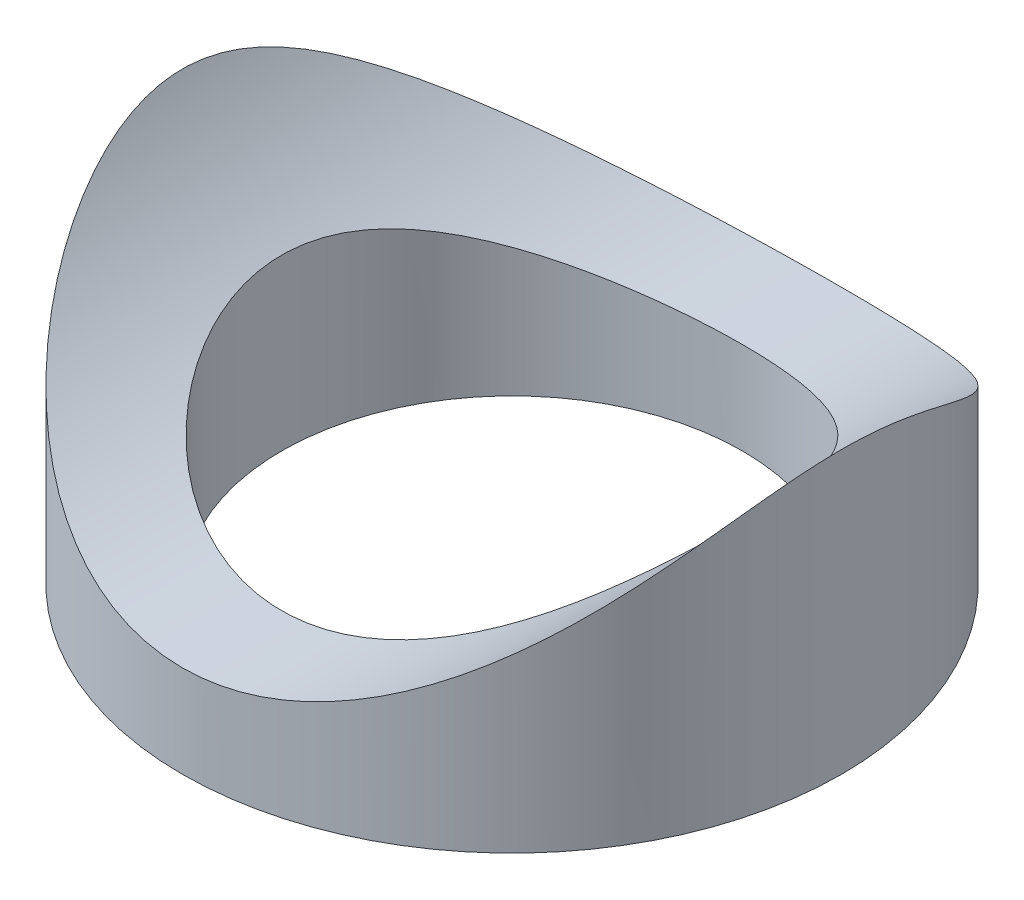
ISO-10303-21;
HEADER;
FILE_DESCRIPTION(('STEP AP214'),'2;1');
FILE_NAME('part.step','',(''),(''),'','','');
FILE_SCHEMA(('AUTOMOTIVE_DESIGN { 1 0 10303 214 1 1 1 1 }'));
ENDSEC;
DATA;
#1=APPLICATION_CONTEXT('core data for automotive mechanical design processes');
#2=APPLICATION_PROTOCOL_DEFINITION('international standard','automotive_design',2000,#1);
#3=PRODUCT_CONTEXT('',#1,'mechanical');
#4=PRODUCT('Part','Part','',(#3));
#5=PRODUCT_RELATED_PRODUCT_CATEGORY('part','',(#4));
#6=PRODUCT_DEFINITION_FORMATION('','',#4);
#7=PRODUCT_DEFINITION_CONTEXT('part definition',#1,'design');
#8=PRODUCT_DEFINITION('design','',#6,#7);
#9=PRODUCT_DEFINITION_SHAPE('','',#8);
#10=(LENGTH_UNIT() NAMED_UNIT(*) SI_UNIT(.MILLI.,.METRE.));
#11=(NAMED_UNIT(*) PLANE_ANGLE_UNIT() SI_UNIT($,.RADIAN.));
#12=(NAMED_UNIT(*) SI_UNIT($,.STERADIAN.) SOLID_ANGLE_UNIT());
#13=UNCERTAINTY_MEASURE_WITH_UNIT(LENGTH_MEASURE(1.E-05),#10,'distance_accuracy_value','');
#14=(GEOMETRIC_REPRESENTATION_CONTEXT(3) GLOBAL_UNCERTAINTY_ASSIGNED_CONTEXT((#13)) GLOBAL_UNIT_ASSIGNED_CONTEXT((#10,
#11,#12)) REPRESENTATION_CONTEXT('',''));
#15=CARTESIAN_POINT('',(0.,0.,0.));
#16=DIRECTION('',(0.,0.,1.));
#17=DIRECTION('',(1.,0.,0.));
#18=AXIS2_PLACEMENT_3D('',#15,#16,#17);
#19=CARTESIAN_POINT('',(0.,10.,0.));
#20=DIRECTION('',(0.,-1.,0.));
#21=DIRECTION('',(0.,0.,-1.));
#22=AXIS2_PLACEMENT_3D('',#19,#20,#21);
#23=CYLINDRICAL_SURFACE('',#22,7.15);
#24=CARTESIAN_POINT('',(0.,1.,-7.15));
#25=CARTESIAN_POINT('',(0.167988015463853,1.00000108155753,-7.1499988949458));
#26=CARTESIAN_POINT('',(0.335992879920423,1.00512334234921,-7.14406886888693));
#27=CARTESIAN_POINT('',(0.670564789268215,1.02549549374263,-7.12046202636341));
#28=CARTESIAN_POINT('',(0.837131635858191,1.0407467592207,-7.1027836152131));
#29=CARTESIAN_POINT('',(1.16751808806879,1.08103619824084,-7.05600798302752));
#30=CARTESIAN_POINT('',(1.33133651401525,1.10607846757693,-7.02690598323148));
#31=CARTESIAN_POINT('',(1.65500657556457,1.16541776550851,-6.95779118775306));
#32=CARTESIAN_POINT('',(1.8148563966595,1.19971894532454,-6.91777349795022));
#33=CARTESIAN_POINT('',(2.12844798142176,1.27662625088511,-6.8277840336711));
#34=CARTESIAN_POINT('',(2.28222349911335,1.3191751811193,-6.77788076302837));
#35=CARTESIAN_POINT('',(2.58403196601238,1.41195379830891,-6.66866369198493));
#36=CARTESIAN_POINT('',(2.73206236382393,1.46218684992114,-6.60934576874789));
#37=CARTESIAN_POINT('',(3.16653963685483,1.62319763657309,-6.41836865351799));
#38=CARTESIAN_POINT('',(3.44358547665019,1.74434089053991,-6.27362362816584));
#39=CARTESIAN_POINT('',(3.88798372671323,1.96676225015789,-6.00428027551445));
#40=CARTESIAN_POINT('',(4.06282629916805,2.06265435552958,-5.88722340007016));
#41=CARTESIAN_POINT('',(4.39872470770204,2.26232704395195,-5.64066255347244));
#42=CARTESIAN_POINT('',(4.55978041791764,2.36610769900277,-5.51115846870836));
#43=CARTESIAN_POINT('',(4.86834543372062,2.57978038457326,-5.24060619362974));
#44=CARTESIAN_POINT('',(5.01581907702101,2.6896873521153,-5.09952935364694));
#45=CARTESIAN_POINT('',(5.29682452603425,2.91334610774556,-4.80700293155699));
#46=CARTESIAN_POINT('',(5.43035817995873,3.02709738348822,-4.65555472894112));
#47=CARTESIAN_POINT('',(5.6862322030435,3.25874152385548,-4.33952371465198));
#48=CARTESIAN_POINT('',(5.80828255342061,3.37667134026922,-4.17473345994307));
#49=CARTESIAN_POINT('',(6.03805000854108,3.61189811570583,-3.83491102925146));
#50=CARTESIAN_POINT('',(6.14576242641082,3.7291948558218,-3.65987553102653));
#51=CARTESIAN_POINT('',(6.34643899979447,3.95981145840405,-3.29964339312331));
#52=CARTESIAN_POINT('',(6.43943334934589,4.07313908131621,-3.11446863344969));
#53=CARTESIAN_POINT('',(6.61035969587434,4.29193563628963,-2.73300103319816));
#54=CARTESIAN_POINT('',(6.68830375087305,4.39741081760123,-2.53671725738382));
#55=CARTESIAN_POINT('',(6.8313998298101,4.59957483736965,-2.12243682703469));
#56=CARTESIAN_POINT('',(6.8957879240776,4.69562652224929,-1.90385484077781));
#57=CARTESIAN_POINT('',(7.00462502082316,4.86370018738762,-1.45300692660444));
#58=CARTESIAN_POINT('',(7.04911793859631,4.93577500158758,-1.22077243031966));
#59=CARTESIAN_POINT('',(7.11041398476884,5.03694900557948,-0.778947331121638));
#60=CARTESIAN_POINT('',(7.1302784102896,5.07073702257414,-0.570901448546908));
#61=CARTESIAN_POINT('',(7.15147715938702,5.10683745240552,-0.151219134828342));
#62=CARTESIAN_POINT('',(7.15283235292934,5.10918531532765,0.0604129829370483));
#63=CARTESIAN_POINT('',(7.13693616632781,5.08205636244413,0.48043406204001));
#64=CARTESIAN_POINT('',(7.11971500162396,5.05263122704015,0.688827732376483));
#65=CARTESIAN_POINT('',(7.06821090019616,4.96709019200255,1.09800163164706));
#66=CARTESIAN_POINT('',(7.0338964139448,4.91092494605964,1.29876704068919));
#67=CARTESIAN_POINT('',(6.95732333022975,4.79020656603394,1.65705744356144));
#68=CARTESIAN_POINT('',(6.91739175514392,4.72868129999898,1.8161504413116));
#69=CARTESIAN_POINT('',(6.82807299898693,4.59574623759871,2.12747716583832));
#70=CARTESIAN_POINT('',(6.77867925538352,4.5243295905973,2.27970604091207));
#71=CARTESIAN_POINT('',(6.67095618638032,4.37436063323471,2.57799988185181));
#72=CARTESIAN_POINT('',(6.6125965923445,4.29578453262183,2.72404174616067));
#73=CARTESIAN_POINT('',(6.48752134117419,4.13403727885885,3.00979729342209));
#74=CARTESIAN_POINT('',(6.42080665335767,4.0508666593674,3.149511707899));
#75=CARTESIAN_POINT('',(6.24388884130149,3.83945229298177,3.49137985002487));
#76=CARTESIAN_POINT('',(6.12861468069926,3.70945563049525,3.68984290114431));
#77=CARTESIAN_POINT('',(5.88015129809202,3.44777541953551,4.07414703007747));
#78=CARTESIAN_POINT('',(5.74695352082575,3.31609109283576,4.25998201614584));
#79=CARTESIAN_POINT('',(5.46284992034077,3.05481924263079,4.61866128850005));
#80=CARTESIAN_POINT('',(5.31196808561842,2.92522914387858,4.7915226628455));
#81=CARTESIAN_POINT('',(4.99225997224588,2.67111071927793,5.12376271688419));
#82=CARTESIAN_POINT('',(4.82344170126334,2.54658016865151,5.28314735662477));
#83=CARTESIAN_POINT('',(4.51104698292928,2.3348364498549,5.55016076915499));
#84=CARTESIAN_POINT('',(4.37131873369326,2.24591404381094,5.66094864053327));
#85=CARTESIAN_POINT('',(4.08160686998257,2.07394379591184,5.87326345844128));
#86=CARTESIAN_POINT('',(3.93162579524515,1.99089450951634,5.97479268399948));
#87=CARTESIAN_POINT('',(3.62177820765863,1.83208788151978,6.16753361773404));
#88=CARTESIAN_POINT('',(3.4619234701632,1.75632211919919,6.25875726244194));
#89=CARTESIAN_POINT('',(3.13260850366837,1.61336030502639,6.4299049228716));
#90=CARTESIAN_POINT('',(2.9631500131638,1.54616270925587,6.50983097461611));
#91=CARTESIAN_POINT('',(2.64562613615451,1.43255817653914,6.64435873894966));
#92=CARTESIAN_POINT('',(2.49896678692552,1.38456799540807,6.70094718353915));
#93=CARTESIAN_POINT('',(2.20020813902601,1.2961576187741,6.80489433114436));
#94=CARTESIAN_POINT('',(2.04810996571397,1.25573586794246,6.85225493058359));
#95=CARTESIAN_POINT('',(1.73929111439598,1.18318497868222,6.93707402614606));
#96=CARTESIAN_POINT('',(1.58257205316605,1.15105297728088,6.97453594101717));
#97=CARTESIAN_POINT('',(1.26543611614853,1.09568709505576,7.03898786520295));
#98=CARTESIAN_POINT('',(1.10501920002368,1.07245331134502,7.06597776022852));
#99=CARTESIAN_POINT('',(0.780911033886621,1.03528642854994,7.109115455377));
#100=CARTESIAN_POINT('',(0.617208254989675,1.02139587597408,7.12521365965528));
#101=CARTESIAN_POINT('',(0.288541997236335,1.00339271078426,7.14607277432099));
#102=CARTESIAN_POINT('',(0.123578515548014,0.999280120141093,7.1508336592338));
#103=CARTESIAN_POINT('',(-0.206224102867415,1.00092610979816,7.14892751733558));
#104=CARTESIAN_POINT('',(-0.371063245067565,1.00668422677614,7.14226102691541));
#105=CARTESIAN_POINT('',(-0.699253304137799,1.02794066448245,7.11762755906592));
#106=CARTESIAN_POINT('',(-0.862604277966941,1.04343861082023,7.09966101600078));
#107=CARTESIAN_POINT('',(-1.17482795891815,1.08237119080872,7.0544552885008));
#108=CARTESIAN_POINT('',(-1.32389436170144,1.10515188146585,7.02797939227665));
#109=CARTESIAN_POINT('',(-1.61877929048442,1.15839845055141,6.96597186463892));
#110=CARTESIAN_POINT('',(-1.76459671126293,1.18886690200013,6.93043720130105));
#111=CARTESIAN_POINT('',(-2.05210891176568,1.2569667158089,6.85080941119685));
#112=CARTESIAN_POINT('',(-2.19380491948299,1.29459591885733,6.80671886436274));
#113=CARTESIAN_POINT('',(-2.47251238681481,1.37644304459676,6.71051024584004));
#114=CARTESIAN_POINT('',(-2.60952208051581,1.42066341808769,6.6583891879165));
#115=CARTESIAN_POINT('',(-3.03487594789062,1.57008138914362,6.48160147655288));
#116=CARTESIAN_POINT('',(-3.3137579350889,1.68634706621757,6.3431050173282));
#117=CARTESIAN_POINT('',(-3.84396499752116,1.94044822780328,6.03659622363694));
#118=CARTESIAN_POINT('',(-4.09526880017902,2.07830016683235,5.86856136091136));
#119=CARTESIAN_POINT('',(-4.51141950177076,2.33379865819459,5.55160491803334));
#120=CARTESIAN_POINT('',(-4.68240944756601,2.44818013371203,5.40800783661563));
#121=CARTESIAN_POINT('',(-5.00803870590189,2.68316339638607,5.10794264770781));
#122=CARTESIAN_POINT('',(-5.16267708735716,2.8037655371766,4.95147380817931));
#123=CARTESIAN_POINT('',(-5.45601794800868,3.04887769824047,4.62627728784498));
#124=CARTESIAN_POINT('',(-5.59468305018599,3.17339604979481,4.45752230430718));
#125=CARTESIAN_POINT('',(-5.85574839138565,3.42327582413514,4.10855146410628));
#126=CARTESIAN_POINT('',(-5.97815391451751,3.54863695904654,3.92833935911923));
#127=CARTESIAN_POINT('',(-6.18049493983635,3.76848338824628,3.59892892236717));
#128=CARTESIAN_POINT('',(-6.26373632191999,3.86346384586665,3.45208154255715));
#129=CARTESIAN_POINT('',(-6.42040000208977,4.05011489074376,3.15115143227213));
#130=CARTESIAN_POINT('',(-6.49382081625872,4.1417849762691,2.99706761309139));
#131=CARTESIAN_POINT('',(-6.63031147930326,4.31916795959385,2.68158995039722));
#132=CARTESIAN_POINT('',(-6.69340632576192,4.40489494548576,2.52021500465166));
#133=CARTESIAN_POINT('',(-6.80879322112156,4.56739378140382,2.18941421426926));
#134=CARTESIAN_POINT('',(-6.86109225300552,4.64417140600294,2.01999366151449));
#135=CARTESIAN_POINT('',(-6.9632693630215,4.7987616254053,1.63763957957528));
#136=CARTESIAN_POINT('',(-7.01057223224903,4.87371130836867,1.42277929732242));
#137=CARTESIAN_POINT('',(-7.06693079745445,4.96512090959931,1.09245472513542));
#138=CARTESIAN_POINT('',(-7.08327779116018,4.99207635050935,0.981091097465617));
#139=CARTESIAN_POINT('',(-7.11081074339003,5.037891369955,0.75610511807645));
#140=CARTESIAN_POINT('',(-7.12199940886123,5.05675519438321,0.642483983763595));
#141=CARTESIAN_POINT('',(-7.13903888291915,5.08562120990808,0.41240389680462));
#142=CARTESIAN_POINT('',(-7.14482830431162,5.09552145268512,0.295927402914954));
#143=CARTESIAN_POINT('',(-7.15068127199945,5.10553088668519,0.0624103624036391));
#144=CARTESIAN_POINT('',(-7.15074519020698,5.1056407138654,-0.0546301470872776));
#145=CARTESIAN_POINT('',(-7.14514412342531,5.09606109027383,-0.28822366587059));
#146=CARTESIAN_POINT('',(-7.13947627584936,5.08636674305278,-0.404776402351219));
#147=CARTESIAN_POINT('',(-7.12257157969353,5.05772029366061,-0.636372472592581));
#148=CARTESIAN_POINT('',(-7.11133155826686,5.03876291712425,-0.751414908020172));
#149=CARTESIAN_POINT('',(-7.08108688206013,4.98842504328915,-0.999492843429912));
#150=CARTESIAN_POINT('',(-7.06105419397326,4.95543077436513,-1.13207349550507));
#151=CARTESIAN_POINT('',(-7.01419148114041,4.87983088069488,-1.39328969128514));
#152=CARTESIAN_POINT('',(-6.98735584579102,4.83721732581607,-1.52192187991998));
#153=CARTESIAN_POINT('',(-6.92734100577797,4.74420753537128,-1.77523017891099));
#154=CARTESIAN_POINT('',(-6.89414336189662,4.69378876139017,-1.89989353049067));
#155=CARTESIAN_POINT('',(-6.82191239891069,4.58701868881174,-2.14483320566658));
#156=CARTESIAN_POINT('',(-6.78288043929166,4.53066877316444,-2.2651105431713));
#157=CARTESIAN_POINT('',(-6.67004251968181,4.37247079533324,-2.58428176074328));
#158=CARTESIAN_POINT('',(-6.59102539479713,4.26639384914443,-2.77924885206972));
#159=CARTESIAN_POINT('',(-6.4181039530466,4.04684306744754,-3.15813724154256));
#160=CARTESIAN_POINT('',(-6.32418972283959,3.93336433620964,-3.34205107107401));
#161=CARTESIAN_POINT('',(-6.12182447860496,3.70279336525416,-3.69973354155075));
#162=CARTESIAN_POINT('',(-6.01335361568659,3.58569636263708,-3.87348785652631));
#163=CARTESIAN_POINT('',(-5.78215001551493,3.35106424007238,-4.21082374641993));
#164=CARTESIAN_POINT('',(-5.65942070470901,3.23352923192617,-4.37440775091919));
#165=CARTESIAN_POINT('',(-5.39243893807011,2.9939895823176,-4.70009094336836));
#166=CARTESIAN_POINT('',(-5.24737118920316,2.87209761150567,-4.86160682847071));
#167=CARTESIAN_POINT('',(-4.94112026506712,2.63308558030784,-5.17256687360979));
#168=CARTESIAN_POINT('',(-4.77993389752316,2.51596647167244,-5.32200863174126));
#169=CARTESIAN_POINT('',(-4.44180403358384,2.2892834500057,-5.60728914070063));
#170=CARTESIAN_POINT('',(-4.26489769767133,2.17970275134474,-5.7431584398821));
#171=CARTESIAN_POINT('',(-3.89522166953088,1.9703683121707,-6.00002903035306));
#172=CARTESIAN_POINT('',(-3.70245987284699,1.8706097342626,-6.12103764786461));
#173=CARTESIAN_POINT('',(-3.362175705186,1.71177490243496,-6.31221321908655));
#174=CARTESIAN_POINT('',(-3.21855377001971,1.64950604849301,-6.38670347689973));
#175=CARTESIAN_POINT('',(-2.9242567391363,1.53195438960882,-6.52669572919649));
#176=CARTESIAN_POINT('',(-2.77358344089789,1.47666981743821,-6.59219999776087));
#177=CARTESIAN_POINT('',(-2.4658957195681,1.37405081624421,-6.71335742059365));
#178=CARTESIAN_POINT('',(-2.30888815986686,1.32670805452982,-6.76902090333983));
#179=CARTESIAN_POINT('',(-1.9891775608386,1.24078647992695,-6.86977050444797));
#180=CARTESIAN_POINT('',(-1.82647536128804,1.20220638105917,-6.91485817491285));
#181=CARTESIAN_POINT('',(-1.52726661876535,1.14091967067453,-6.98634377869699));
#182=CARTESIAN_POINT('',(-1.39154606408949,1.11659403205927,-7.01465975968285));
#183=CARTESIAN_POINT('',(-1.11769302091288,1.0746149552832,-7.06346934953866));
#184=CARTESIAN_POINT('',(-0.979560828028381,1.05696070527478,-7.08396391020769));
#185=CARTESIAN_POINT('',(-0.701596962410924,1.02859519228974,-7.11687087103667));
#186=CARTESIAN_POINT('',(-0.561764947305554,1.0178853524538,-7.12928161455591));
#187=CARTESIAN_POINT('',(-0.281292403272919,1.00358828324475,-7.14584550582072));
#188=CARTESIAN_POINT('',(-0.140652107451416,0.999999094439292,-7.15000092523387));
#189=CARTESIAN_POINT('',(0.,1.,-7.15));
#190=B_SPLINE_CURVE_WITH_KNOTS('',3,(#24,#25,#26,#27,#28,#29,#30,#31,#32,#33,#34,#35,#36,#37,
#38,#39,#40,#41,#42,#43,#44,#45,#46,#47,#48,#49,#50,#51,#52,#53,#54,#55,#56,#57,#58,#59,#60,#61,
#62,#63,#64,#65,#66,#67,#68,#69,#70,#71,#72,#73,#74,#75,#76,#77,#78,#79,#80,#81,#82,#83,#84,#85,
#86,#87,#88,#89,#90,#91,#92,#93,#94,#95,#96,#97,#98,#99,#100,#101,#102,#103,#104,#105,#106,#107,
#108,#109,#110,#111,#112,#113,#114,#115,#116,#117,#118,#119,#120,#121,#122,#123,#124,#125,#126,
#127,#128,#129,#130,#131,#132,#133,#134,#135,#136,#137,#138,#139,#140,#141,#142,#143,#144,#145,
#146,#147,#148,#149,#150,#151,#152,#153,#154,#155,#156,#157,#158,#159,#160,#161,#162,#163,#164,
#165,#166,#167,#168,#169,#170,#171,#172,#173,#174,#175,#176,#177,#178,#179,#180,#181,#182,#183,
#184,#185,#186,#187,#188,#189),.UNSPECIFIED.,.T.,.F.,(4,2,2,2,2,2,2,2,2,2,2,2,2,2,2,2,2,2,2,2,2,
2,2,2,2,2,2,2,2,2,2,2,2,2,2,2,2,2,2,2,2,2,2,2,2,2,2,2,2,2,2,2,2,2,2,2,2,2,2,2,2,2,2,2,2,2,2,2,2,
2,2,2,2,2,2,2,2,2,2,2,2,2,4),(0.,0.503812464215795,1.00769332818616,1.51178520260977,
2.01610346245335,2.51704206537157,3.01820064618079,4.01984017623099,4.71274926369415,
5.40566467621605,6.10035048026139,6.79494406318974,7.50396139999734,8.21320993866278,
8.92098405083729,9.62818873278379,10.3682983925572,11.1067662199157,11.7390647067533,
12.3706501905585,13.0012099137216,13.632937811597,14.157761143727,14.6829497961092,
15.2099521084776,15.7368933371016,16.5271805396226,17.3178463072676,18.1074516835895,
18.896706012578,19.4939853302393,20.0911172276658,20.6875502426537,21.2838756326198,
21.7764735453217,22.2689701167181,22.7612963696359,23.2536279955323,23.7481866551029,
24.2427464259309,24.7372829831974,25.2318005320715,25.6906077970772,26.1495688246652,
26.6083916720727,27.0673855515008,28.0605980149893,29.054571291501,29.8062678942711,
30.558007276877,31.3114714334492,32.0646901237068,32.645383687066,33.2261648960747,
33.8055186319823,34.3844964460523,35.0792464260865,35.4261191426814,35.7728096223512,
36.123395422653,36.4739584498948,36.8246966435592,37.175634780548,37.5892320851451,
38.0031716124576,38.4183295326586,38.8333908650312,39.5390990003157,40.2452787375157,
40.9524313695517,41.6594144158933,42.4055274805436,43.1517886058309,43.8963303267758,
44.6405035071728,45.160123680268,45.6796121097389,46.1985520264322,46.7174157359475,
47.1393262013564,47.5611853075339,47.9831308393765,48.404960245817),.UNSPECIFIED.);
#191=CARTESIAN_POINT('',(0.,1.,-7.15));
#192=VERTEX_POINT('',#191);
#193=EDGE_CURVE('E10',#192,#192,#190,.T.);
#194=ORIENTED_EDGE('',*,*,#193,.T.);
#195=EDGE_LOOP('',(#194));
#196=FACE_BOUND('',#195,.T.);
#197=CARTESIAN_POINT('',(0.,-1.,0.));
#198=DIRECTION('',(0.,-1.,0.));
#199=DIRECTION('',(0.,0.,-1.));
#200=AXIS2_PLACEMENT_3D('',#197,#198,#199);
#201=CIRCLE('',#200,7.15);
#202=CARTESIAN_POINT('',(0.,-1.,-7.15));
#203=VERTEX_POINT('',#202);
#204=EDGE_CURVE('E45',#203,#203,#201,.T.);
#205=ORIENTED_EDGE('',*,*,#204,.F.);
#206=EDGE_LOOP('',(#205));
#207=FACE_BOUND('',#206,.T.);
#208=ADVANCED_FACE('F30',(#196,#207),#23,.T.);
#209=CARTESIAN_POINT('',(0.,10.,0.));
#210=DIRECTION('',(0.,-1.,0.));
#211=DIRECTION('',(0.,0.,-1.));
#212=AXIS2_PLACEMENT_3D('',#209,#210,#211);
#213=CYLINDRICAL_SURFACE('',#212,5.);
#214=CARTESIAN_POINT('',(0.,1.,-5.));
#215=CARTESIAN_POINT('',(0.127814799959021,1.00000094598302,-4.99999898913697));
#216=CARTESIAN_POINT('',(0.2556580150913,1.00296692616785,-4.99509150804941));
#217=CARTESIAN_POINT('',(0.510377679655769,1.01476027565692,-4.97552478821181));
#218=CARTESIAN_POINT('',(0.637253545087954,1.02359093970321,-4.96086006789833));
#219=CARTESIAN_POINT('',(0.889236612027991,1.04691458981523,-4.92194458770257));
#220=CARTESIAN_POINT('',(1.01434015993517,1.061417888312,-4.89767636841787));
#221=CARTESIAN_POINT('',(1.26168781014747,1.09573794712821,-4.83986421870816));
#222=CARTESIAN_POINT('',(1.38393066550779,1.11555697928336,-4.80631632214674));
#223=CARTESIAN_POINT('',(1.62406390141582,1.15992371013292,-4.73055786138419));
#224=CARTESIAN_POINT('',(1.74197432894678,1.18444511942006,-4.6883953764538));
#225=CARTESIAN_POINT('',(1.97350044520933,1.23774687508711,-4.59574417531676));
#226=CARTESIAN_POINT('',(2.08711447483184,1.26652884607231,-4.5452522821589));
#227=CARTESIAN_POINT('',(2.42048477896346,1.35834419918274,-4.38205091593124));
#228=CARTESIAN_POINT('',(2.63306677536784,1.42690425822172,-4.25752059354876));
#229=CARTESIAN_POINT('',(3.05094236899352,1.57912754356575,-3.97001923183099));
#230=CARTESIAN_POINT('',(3.2544139066575,1.66354727271815,-3.8048263790288));
#231=CARTESIAN_POINT('',(3.63256607586959,1.83646910140465,-3.44565683460023));
#232=CARTESIAN_POINT('',(3.80720890101852,1.92497636987691,-3.25164296993684));
#233=CARTESIAN_POINT('',(4.14477814512415,2.10918464676324,-2.811934590916));
#234=CARTESIAN_POINT('',(4.30353531322219,2.20440843597973,-2.56281288307542));
#235=CARTESIAN_POINT('',(4.57635785947898,2.3777127253976,-2.03582803408933));
#236=CARTESIAN_POINT('',(4.69049629710975,2.4558211576114,-1.75801282737518));
#237=CARTESIAN_POINT('',(4.84643888571484,2.56604215072277,-1.25069314483377));
#238=CARTESIAN_POINT('',(4.89910112224796,2.60472927023831,-1.02596118281174));
#239=CARTESIAN_POINT('',(4.97291736325497,2.659525139134,-0.568796285473926));
#240=CARTESIAN_POINT('',(4.99411133116625,2.67566252423438,-0.336373501544346));
#241=CARTESIAN_POINT('',(5.00375967004685,2.68296726259996,0.130034762568329));
#242=CARTESIAN_POINT('',(4.99214675538867,2.67408329817343,0.364022471013796));
#243=CARTESIAN_POINT('',(4.93678463229914,2.63261819188903,0.826070640682043));
#244=CARTESIAN_POINT('',(4.893010987544,2.60001903096701,1.05412645824119));
#245=CARTESIAN_POINT('',(4.77653786748339,2.51626762856234,1.49535066503309));
#246=CARTESIAN_POINT('',(4.70426176575395,2.46538786786335,1.70868552621608));
#247=CARTESIAN_POINT('',(4.53345607100018,2.35058909861419,2.12074905398304));
#248=CARTESIAN_POINT('',(4.43491691120353,2.28666534055554,2.31947236433423));
#249=CARTESIAN_POINT('',(4.19434974772517,2.13933757641914,2.73397034880551));
#250=CARTESIAN_POINT('',(4.04771356980097,2.05448742901317,2.94655099303329));
#251=CARTESIAN_POINT('',(3.72395137644405,1.88242042491801,3.346399344745));
#252=CARTESIAN_POINT('',(3.54679583070186,1.79520134556694,3.53364221933684));
#253=CARTESIAN_POINT('',(3.2464840236777,1.66205504124393,3.80553314973137));
#254=CARTESIAN_POINT('',(3.13264755828195,1.61442501377199,3.89980403855821));
#255=CARTESIAN_POINT('',(2.89633506754752,1.52205500809667,4.07837673836407));
#256=CARTESIAN_POINT('',(2.77386239663795,1.47731392058166,4.16268238630683));
#257=CARTESIAN_POINT('',(2.52082809644101,1.39192916310861,4.3206101694101));
#258=CARTESIAN_POINT('',(2.39026528799418,1.35128609272648,4.39423074194066));
#259=CARTESIAN_POINT('',(2.12188424919549,1.27528657434612,4.52992224714623));
#260=CARTESIAN_POINT('',(1.98407055912672,1.23992687010131,4.59200029952718));
#261=CARTESIAN_POINT('',(1.71074312298416,1.17751972865805,4.70038574222543));
#262=CARTESIAN_POINT('',(1.57560677302414,1.15009547827463,4.74742689544842));
#263=CARTESIAN_POINT('',(1.30080558918942,1.10162895570598,4.82995541578289));
#264=CARTESIAN_POINT('',(1.16114335151333,1.08058309396542,4.86544928217127));
#265=CARTESIAN_POINT('',(0.878528653152936,1.04550872428341,4.92432794337898));
#266=CARTESIAN_POINT('',(0.735578765756739,1.03147491116664,4.9477218932251));
#267=CARTESIAN_POINT('',(0.447663505369586,1.0108515925142,4.98202824110965));
#268=CARTESIAN_POINT('',(0.302698427690866,1.00426100762724,4.99294244885302));
#269=CARTESIAN_POINT('',(0.0323034784607435,0.999115794092643,5.00146465692226));
#270=CARTESIAN_POINT('',(-0.093059903996472,0.999577219190825,5.00070188395734));
#271=CARTESIAN_POINT('',(-0.343269314853001,1.00617206349806,4.98977442161754));
#272=CARTESIAN_POINT('',(-0.468115171826915,1.01230723142959,4.97960683355424));
#273=CARTESIAN_POINT('',(-0.716246544654474,1.03009950173006,4.9500098421878));
#274=CARTESIAN_POINT('',(-0.839532700792893,1.04175425734661,4.93058437501702));
#275=CARTESIAN_POINT('',(-1.08376716437271,1.07031220579108,4.88271871989112));
#276=CARTESIAN_POINT('',(-1.20471455126712,1.08721742228016,4.85427505600537));
#277=CARTESIAN_POINT('',(-1.44022006490596,1.12536897090896,4.78960031168625));
#278=CARTESIAN_POINT('',(-1.5548625401075,1.14648612572472,4.75359959394617));
#279=CARTESIAN_POINT('',(-1.78053348847966,1.19288708774016,4.67376129570744));
#280=CARTESIAN_POINT('',(-1.89156070189417,1.21817232911207,4.62992101729895));
#281=CARTESIAN_POINT('',(-2.21831819512106,1.2995411072737,4.48725667454077));
#282=CARTESIAN_POINT('',(-2.42790065021433,1.36116739124341,4.37724000445487));
#283=CARTESIAN_POINT('',(-2.84772741198662,1.50164050082164,4.11795616444798));
#284=CARTESIAN_POINT('',(-3.05579573269604,1.58160943236082,3.96580532996317));
#285=CARTESIAN_POINT('',(-3.44503942992681,1.74773915897447,3.6328223308629));
#286=CARTESIAN_POINT('',(-3.62618313957045,1.83390707092333,3.451956902921));
#287=CARTESIAN_POINT('',(-3.98117274187309,2.01683248103585,3.03875139847712));
#288=CARTESIAN_POINT('',(-4.15085858866158,2.11347745934896,2.8027654343516));
#289=CARTESIAN_POINT('',(-4.44837831603031,2.2942533031249,2.30146074631234));
#290=CARTESIAN_POINT('',(-4.57625423649267,2.37839669218738,2.03617184791769));
#291=CARTESIAN_POINT('',(-4.76231972800488,2.50588336613993,1.54086598977731));
#292=CARTESIAN_POINT('',(-4.82958880733965,2.55411164796973,1.31557175452854));
#293=CARTESIAN_POINT('',(-4.90645334289188,2.61021117596618,0.969890815250908));
#294=CARTESIAN_POINT('',(-4.92806694679441,2.62620272610892,0.853391381323574));
#295=CARTESIAN_POINT('',(-4.96301423923287,2.65222684820047,0.618516560043097));
#296=CARTESIAN_POINT('',(-4.97635113384398,2.66226172746624,0.500141917318094));
#297=CARTESIAN_POINT('',(-4.99457389134283,2.67600411479871,0.261864928403453));
#298=CARTESIAN_POINT('',(-4.9994232455336,2.67968428753236,0.141958206447611));
#299=CARTESIAN_POINT('',(-5.00047976543356,2.68048466135,-0.0979153721788118));
#300=CARTESIAN_POINT('',(-4.9966869213365,2.6776048549904,-0.217882228917472));
#301=CARTESIAN_POINT('',(-4.98051796908317,2.66539917107589,-0.45693817185626));
#302=CARTESIAN_POINT('',(-4.96813960585116,2.65607159995077,-0.576027019130643));
#303=CARTESIAN_POINT('',(-4.93500346073603,2.63134924580545,-0.812410023220574));
#304=CARTESIAN_POINT('',(-4.9142423979122,2.61595208723939,-0.929703458643979));
#305=CARTESIAN_POINT('',(-4.84245682056758,2.56341891652931,-1.26527728921237));
#306=CARTESIAN_POINT('',(-4.78095689159326,2.51914344961544,-1.48029983817779));
#307=CARTESIAN_POINT('',(-4.63147885920864,2.41589221370015,-1.89698506962286));
#308=CARTESIAN_POINT('',(-4.54349071964826,2.35691087423052,-2.09864265283575));
#309=CARTESIAN_POINT('',(-4.32813027370672,2.21994697977263,-2.51605672063694));
#310=CARTESIAN_POINT('',(-4.19679537859071,2.14043820275728,-2.72926296875098));
#311=CARTESIAN_POINT('',(-3.9048278127975,1.97666383179162,-3.13279313085175));
#312=CARTESIAN_POINT('',(-3.74417091014908,1.89239434361489,-3.3230979013931));
#313=CARTESIAN_POINT('',(-3.46833519197884,1.76057024162246,-3.60441275384445));
#314=CARTESIAN_POINT('',(-3.3619560748471,1.71229376874158,-3.70385224231246));
#315=CARTESIAN_POINT('',(-3.14042977533258,1.61771679369944,-3.8934484798563));
#316=CARTESIAN_POINT('',(-3.02528551187502,1.57141564167243,-3.98360829588056));
#317=CARTESIAN_POINT('',(-2.78659253045054,1.48195114401084,-4.15408631888487));
#318=CARTESIAN_POINT('',(-2.66303575578666,1.43879089062995,-4.23439487910416));
#319=CARTESIAN_POINT('',(-2.40828529952101,1.35684097210845,-4.38428847552986));
#320=CARTESIAN_POINT('',(-2.27709594594654,1.31804886596282,-4.45387950897261));
#321=CARTESIAN_POINT('',(-2.01123114332619,1.24683114593754,-4.57996049721231));
#322=CARTESIAN_POINT('',(-1.87672961448513,1.21426853235489,-4.6367390139502));
#323=CARTESIAN_POINT('',(-1.6021499842605,1.15527141382547,-4.73862213924244));
#324=CARTESIAN_POINT('',(-1.46207519168216,1.12883333456855,-4.78373355857477));
#325=CARTESIAN_POINT('',(-1.17784251923966,1.08294246085055,-4.86151577209312));
#326=CARTESIAN_POINT('',(-1.03369775047637,1.06346950293002,-4.89422249373696));
#327=CARTESIAN_POINT('',(-0.742361195213597,1.03204706544149,-4.94679445898064));
#328=CARTESIAN_POINT('',(-0.595172005054251,1.02009142774663,-4.96667021396018));
#329=CARTESIAN_POINT('',(-0.372956022609536,1.00806839802011,-4.98662965522762));
#330=CARTESIAN_POINT('',(-0.298492219692972,1.00504570468951,-4.99164052514319));
#331=CARTESIAN_POINT('',(-0.149355517256566,1.00101118786757,-4.99832606160945));
#332=CARTESIAN_POINT('',(-0.0746826092453346,0.999999447258999,-5.0000005906506));
#333=CARTESIAN_POINT('',(0.,1.,-5.));
#334=B_SPLINE_CURVE_WITH_KNOTS('',3,(#214,#215,#216,#217,#218,#219,#220,#221,#222,#223,#224,
#225,#226,#227,#228,#229,#230,#231,#232,#233,#234,#235,#236,#237,#238,#239,#240,#241,#242,#243,
#244,#245,#246,#247,#248,#249,#250,#251,#252,#253,#254,#255,#256,#257,#258,#259,#260,#261,#262,
#263,#264,#265,#266,#267,#268,#269,#270,#271,#272,#273,#274,#275,#276,#277,#278,#279,#280,#281,
#282,#283,#284,#285,#286,#287,#288,#289,#290,#291,#292,#293,#294,#295,#296,#297,#298,#299,#300,
#301,#302,#303,#304,#305,#306,#307,#308,#309,#310,#311,#312,#313,#314,#315,#316,#317,#318,#319,
#320,#321,#322,#323,#324,#325,#326,#327,#328,#329,#330,#331,#332,#333),.UNSPECIFIED.,.T.,.F.,(4,
2,2,2,2,2,2,2,2,2,2,2,2,2,2,2,2,2,2,2,2,2,2,2,2,2,2,2,2,2,2,2,2,2,2,2,2,2,2,2,2,2,2,2,2,2,2,2,2,
2,2,2,2,2,2,2,2,2,2,4),(0.,0.383366086203991,0.766947727427517,1.15122995734657,
1.53567668404194,1.91803365773239,2.30053680627112,3.06460112029338,3.88750705558618,
4.71148373279119,5.63809849690658,6.56318958646828,7.26234313035077,7.9606080156014,
8.66030605378806,9.36053628615764,10.0507350602351,10.7411855955686,11.5536684663773,
12.3669419508678,12.8323057885427,13.2974898572576,13.7627418880278,14.2277059810868,
14.6641511664,15.1003502761274,15.536218864741,15.9720242394191,16.3476537427484,
16.7233990586507,17.0989847628698,17.4747154073943,17.8403268389851,18.2060643352503,
18.9369890179331,19.7435539330616,20.5510600931223,21.4657487630982,22.3795148647277,
23.0963211038502,23.4546201907535,23.8127803997564,24.1724774638403,24.5321749360708,
24.8919669223739,25.2518998659199,25.9329330521669,26.614224601361,27.399564151216,
28.1855556758721,28.6453252127485,29.104942303701,29.5650059376013,30.0248111896349,
30.4729041132157,30.9207348648853,31.3672584851018,31.8134158386362,32.0374086756102,
32.2614107444086),.UNSPECIFIED.);
#335=CARTESIAN_POINT('',(0.,1.,-5.));
#336=VERTEX_POINT('',#335);
#337=EDGE_CURVE('E34',#336,#336,#334,.T.);
#338=ORIENTED_EDGE('',*,*,#337,.F.);
#339=EDGE_LOOP('',(#338));
#340=FACE_BOUND('',#339,.T.);
#341=CARTESIAN_POINT('',(0.,-1.,0.));
#342=DIRECTION('',(0.,-1.,0.));
#343=DIRECTION('',(0.,0.,-1.));
#344=AXIS2_PLACEMENT_3D('',#341,#342,#343);
#345=CIRCLE('',#344,5.);
#346=CARTESIAN_POINT('',(0.,-1.,-5.));
#347=VERTEX_POINT('',#346);
#348=EDGE_CURVE('E69',#347,#347,#345,.T.);
#349=ORIENTED_EDGE('',*,*,#348,.T.);
#350=EDGE_LOOP('',(#349));
#351=FACE_BOUND('',#350,.T.);
#352=ADVANCED_FACE('F56',(#340,#351),#213,.F.);
#353=CARTESIAN_POINT('',(0.,9.28,-7.15));
#354=DIRECTION('',(0.,0.,1.));
#355=DIRECTION('',(1.,0.,0.));
#356=AXIS2_PLACEMENT_3D('',#353,#354,#355);
#357=CYLINDRICAL_SURFACE('',#356,8.28);
#358=ORIENTED_EDGE('',*,*,#337,.T.);
#359=EDGE_LOOP('',(#358));
#360=FACE_BOUND('',#359,.T.);
#361=ORIENTED_EDGE('',*,*,#193,.F.);
#362=EDGE_LOOP('',(#361));
#363=FACE_BOUND('',#362,.T.);
#364=ADVANCED_FACE('F51',(#360,#363),#357,.F.);
#365=CARTESIAN_POINT('',(0.,-1.,0.));
#366=DIRECTION('',(0.,-1.,0.));
#367=DIRECTION('',(0.,0.,-1.));
#368=AXIS2_PLACEMENT_3D('',#365,#366,#367);
#369=PLANE('',#368);
#370=ORIENTED_EDGE('',*,*,#204,.T.);
#371=EDGE_LOOP('',(#370));
#372=FACE_BOUND('',#371,.T.);
#373=ORIENTED_EDGE('',*,*,#348,.F.);
#374=EDGE_LOOP('',(#373));
#375=FACE_BOUND('',#374,.T.);
#376=ADVANCED_FACE('F55',(#372,#375),#369,.T.);
#377=CLOSED_SHELL('',(#208,#352,#364,#376));
#378=MANIFOLD_SOLID_BREP('B2',#377);
#379=ADVANCED_BREP_SHAPE_REPRESENTATION('',(#18,#378),#14);
#380=SHAPE_DEFINITION_REPRESENTATION(#9,#379);
ENDSEC;
END-ISO-10303-21;
